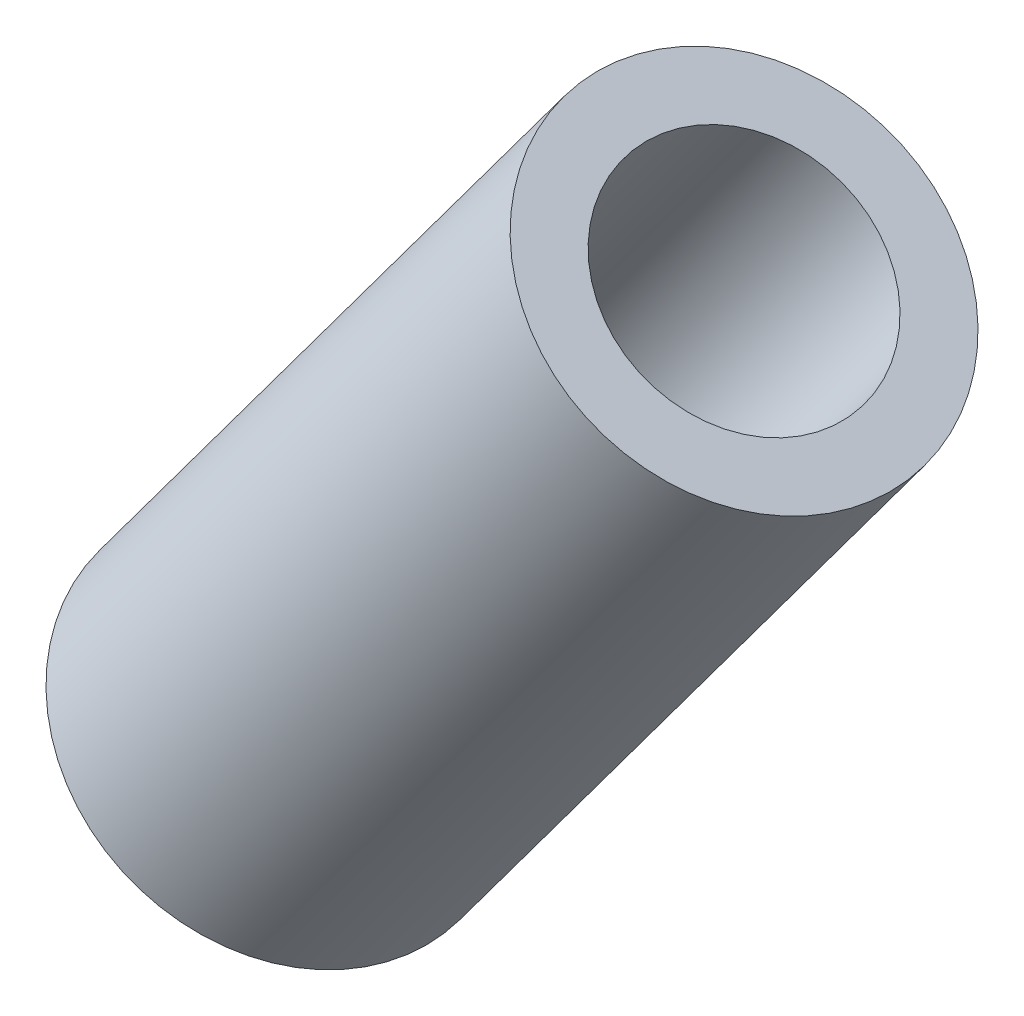
ISO-10303-21;
HEADER;
FILE_DESCRIPTION(('STEP AP214'),'2;1');
FILE_NAME('part.step','',(''),(''),'','','');
FILE_SCHEMA(('AUTOMOTIVE_DESIGN { 1 0 10303 214 1 1 1 1 }'));
ENDSEC;
DATA;
#1=APPLICATION_CONTEXT('core data for automotive mechanical design processes');
#2=APPLICATION_PROTOCOL_DEFINITION('international standard','automotive_design',2000,#1);
#3=PRODUCT_CONTEXT('',#1,'mechanical');
#4=PRODUCT('Part','Part','',(#3));
#5=PRODUCT_RELATED_PRODUCT_CATEGORY('part','',(#4));
#6=PRODUCT_DEFINITION_FORMATION('','',#4);
#7=PRODUCT_DEFINITION_CONTEXT('part definition',#1,'design');
#8=PRODUCT_DEFINITION('design','',#6,#7);
#9=PRODUCT_DEFINITION_SHAPE('','',#8);
#10=(LENGTH_UNIT() NAMED_UNIT(*) SI_UNIT(.MILLI.,.METRE.));
#11=(NAMED_UNIT(*) PLANE_ANGLE_UNIT() SI_UNIT($,.RADIAN.));
#12=(NAMED_UNIT(*) SI_UNIT($,.STERADIAN.) SOLID_ANGLE_UNIT());
#13=UNCERTAINTY_MEASURE_WITH_UNIT(LENGTH_MEASURE(1.E-05),#10,'distance_accuracy_value','');
#14=(GEOMETRIC_REPRESENTATION_CONTEXT(3) GLOBAL_UNCERTAINTY_ASSIGNED_CONTEXT((#13)) GLOBAL_UNIT_ASSIGNED_CONTEXT((#10,
#11,#12)) REPRESENTATION_CONTEXT('',''));
#15=CARTESIAN_POINT('',(0.,0.,0.));
#16=DIRECTION('',(0.,0.,1.));
#17=DIRECTION('',(1.,0.,0.));
#18=AXIS2_PLACEMENT_3D('',#15,#16,#17);
#19=CARTESIAN_POINT('',(0.,0.,0.));
#20=DIRECTION('',(0.596262476018023,0.802789548818902,0.));
#21=DIRECTION('',(-0.802789548818902,0.596262476018023,0.));
#22=AXIS2_PLACEMENT_3D('',#19,#20,#21);
#23=PLANE('',#22);
#24=CARTESIAN_POINT('',(0.,0.,0.));
#25=DIRECTION('',(0.596262476018023,0.802789548818902,0.));
#26=DIRECTION('',(-0.802789548818902,0.596262476018023,0.));
#27=AXIS2_PLACEMENT_3D('',#24,#25,#26);
#28=CIRCLE('',#27,7.9375);
#29=CARTESIAN_POINT('',(-6.37214204375003,4.73283340339306,0.));
#30=VERTEX_POINT('',#29);
#31=EDGE_CURVE('E74',#30,#30,#28,.F.);
#32=ORIENTED_EDGE('',*,*,#31,.F.);
#33=EDGE_LOOP('',(#32));
#34=FACE_BOUND('',#33,.T.);
#35=CARTESIAN_POINT('',(0.,0.,0.));
#36=DIRECTION('',(0.596262476018023,0.802789548818902,0.));
#37=DIRECTION('',(-0.802789548818902,0.596262476018023,0.));
#38=AXIS2_PLACEMENT_3D('',#35,#36,#37);
#39=CIRCLE('',#38,11.90625);
#40=CARTESIAN_POINT('',(-9.55821306562505,7.09925010508959,0.));
#41=VERTEX_POINT('',#40);
#42=EDGE_CURVE('E64',#41,#41,#39,.T.);
#43=ORIENTED_EDGE('',*,*,#42,.F.);
#44=EDGE_LOOP('',(#43));
#45=FACE_BOUND('',#44,.T.);
#46=ADVANCED_FACE('F57',(#34,#45),#23,.F.);
#47=CARTESIAN_POINT('',(30.2901337817156,40.7817090800002,0.));
#48=DIRECTION('',(0.596262476018023,0.802789548818902,0.));
#49=DIRECTION('',(-0.802789548818902,0.596262476018023,0.));
#50=AXIS2_PLACEMENT_3D('',#47,#48,#49);
#51=PLANE('',#50);
#52=CARTESIAN_POINT('',(30.2901337817156,40.7817090800002,0.));
#53=DIRECTION('',(0.596262476018023,0.802789548818902,0.));
#54=DIRECTION('',(-0.802789548818902,0.596262476018023,0.));
#55=AXIS2_PLACEMENT_3D('',#52,#53,#54);
#56=CIRCLE('',#55,7.9375);
#57=CARTESIAN_POINT('',(23.9179917379656,45.5145424833933,0.));
#58=VERTEX_POINT('',#57);
#59=EDGE_CURVE('E69',#58,#58,#56,.F.);
#60=ORIENTED_EDGE('',*,*,#59,.T.);
#61=EDGE_LOOP('',(#60));
#62=FACE_BOUND('',#61,.T.);
#63=CARTESIAN_POINT('',(30.2901337817156,40.7817090800002,0.));
#64=DIRECTION('',(0.596262476018023,0.802789548818902,0.));
#65=DIRECTION('',(-0.802789548818902,0.596262476018023,0.));
#66=AXIS2_PLACEMENT_3D('',#63,#64,#65);
#67=CIRCLE('',#66,11.90625);
#68=CARTESIAN_POINT('',(20.7319207160905,47.8809591850898,0.));
#69=VERTEX_POINT('',#68);
#70=EDGE_CURVE('E11',#69,#69,#67,.T.);
#71=ORIENTED_EDGE('',*,*,#70,.T.);
#72=EDGE_LOOP('',(#71));
#73=FACE_BOUND('',#72,.T.);
#74=ADVANCED_FACE('F86',(#62,#73),#51,.T.);
#75=CARTESIAN_POINT('',(0.,0.,0.));
#76=DIRECTION('',(0.596262476018023,0.802789548818902,0.));
#77=DIRECTION('',(-0.802789548818902,0.596262476018023,0.));
#78=AXIS2_PLACEMENT_3D('',#75,#76,#77);
#79=CYLINDRICAL_SURFACE('',#78,11.90625);
#80=ORIENTED_EDGE('',*,*,#70,.F.);
#81=EDGE_LOOP('',(#80));
#82=FACE_BOUND('',#81,.T.);
#83=ORIENTED_EDGE('',*,*,#42,.T.);
#84=EDGE_LOOP('',(#83));
#85=FACE_BOUND('',#84,.T.);
#86=ADVANCED_FACE('F91',(#82,#85),#79,.T.);
#87=CARTESIAN_POINT('',(-2.38504990407209,-3.21115819527561,0.));
#88=DIRECTION('',(0.596262476018023,0.802789548818902,0.));
#89=DIRECTION('',(-0.802789548818902,0.596262476018023,0.));
#90=AXIS2_PLACEMENT_3D('',#87,#88,#89);
#91=CYLINDRICAL_SURFACE('',#90,7.9375);
#92=ORIENTED_EDGE('',*,*,#31,.T.);
#93=EDGE_LOOP('',(#92));
#94=FACE_BOUND('',#93,.T.);
#95=ORIENTED_EDGE('',*,*,#59,.F.);
#96=EDGE_LOOP('',(#95));
#97=FACE_BOUND('',#96,.T.);
#98=ADVANCED_FACE('F81',(#94,#97),#91,.F.);
#99=CLOSED_SHELL('',(#46,#74,#86,#98));
#100=MANIFOLD_SOLID_BREP('B2',#99);
#101=ADVANCED_BREP_SHAPE_REPRESENTATION('',(#18,#100),#14);
#102=SHAPE_DEFINITION_REPRESENTATION(#9,#101);
ENDSEC;
END-ISO-10303-21;
